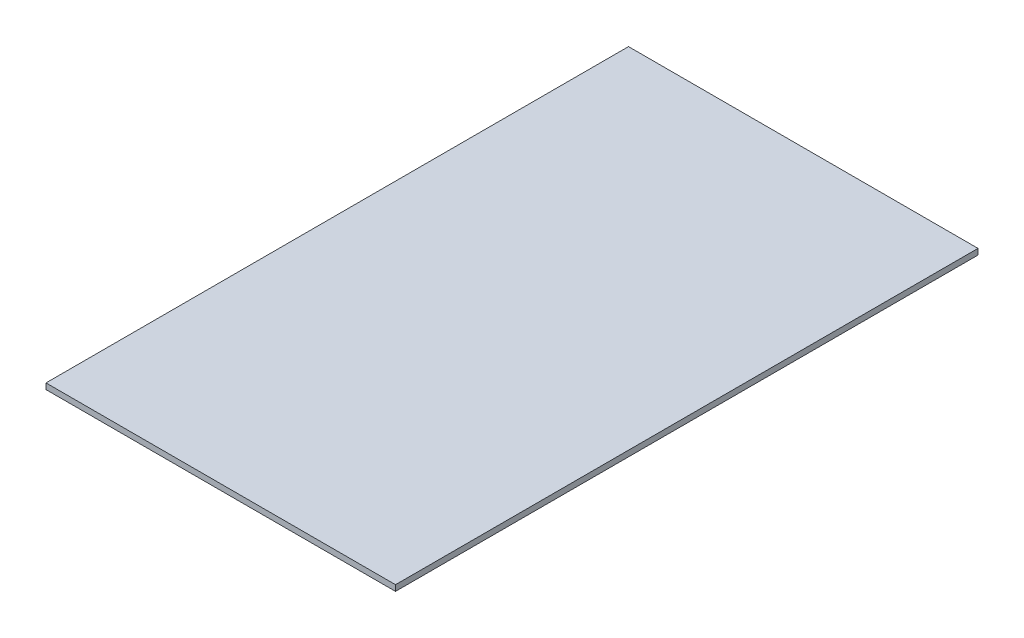
ISO-10303-21;
HEADER;
FILE_DESCRIPTION(('STEP AP214'),'2;1');
FILE_NAME('part.step','',(''),(''),'','','');
FILE_SCHEMA(('AUTOMOTIVE_DESIGN { 1 0 10303 214 1 1 1 1 }'));
ENDSEC;
DATA;
#1=APPLICATION_CONTEXT('core data for automotive mechanical design processes');
#2=APPLICATION_PROTOCOL_DEFINITION('international standard','automotive_design',2000,#1);
#3=PRODUCT_CONTEXT('',#1,'mechanical');
#4=PRODUCT('Part','Part','',(#3));
#5=PRODUCT_RELATED_PRODUCT_CATEGORY('part','',(#4));
#6=PRODUCT_DEFINITION_FORMATION('','',#4);
#7=PRODUCT_DEFINITION_CONTEXT('part definition',#1,'design');
#8=PRODUCT_DEFINITION('design','',#6,#7);
#9=PRODUCT_DEFINITION_SHAPE('','',#8);
#10=(LENGTH_UNIT() NAMED_UNIT(*) SI_UNIT(.MILLI.,.METRE.));
#11=(NAMED_UNIT(*) PLANE_ANGLE_UNIT() SI_UNIT($,.RADIAN.));
#12=(NAMED_UNIT(*) SI_UNIT($,.STERADIAN.) SOLID_ANGLE_UNIT());
#13=UNCERTAINTY_MEASURE_WITH_UNIT(LENGTH_MEASURE(1.E-05),#10,'distance_accuracy_value','');
#14=(GEOMETRIC_REPRESENTATION_CONTEXT(3) GLOBAL_UNCERTAINTY_ASSIGNED_CONTEXT((#13)) GLOBAL_UNIT_ASSIGNED_CONTEXT((#10,
#11,#12)) REPRESENTATION_CONTEXT('',''));
#15=CARTESIAN_POINT('',(0.,0.,0.));
#16=DIRECTION('',(0.,0.,1.));
#17=DIRECTION('',(1.,0.,0.));
#18=AXIS2_PLACEMENT_3D('',#15,#16,#17);
#19=CARTESIAN_POINT('',(-1020.,34.,-1020.));
#20=DIRECTION('',(0.,0.,-1.));
#21=DIRECTION('',(-1.,0.,0.));
#22=AXIS2_PLACEMENT_3D('',#19,#20,#21);
#23=PLANE('',#22);
#24=DIRECTION('',(1.,0.,0.));
#25=VECTOR('',#24,1.);
#26=CARTESIAN_POINT('',(-1020.,0.,-1020.));
#27=LINE('',#26,#25);
#28=CARTESIAN_POINT('',(-1020.,0.,-1020.));
#29=VERTEX_POINT('',#28);
#30=CARTESIAN_POINT('',(1020.,0.,-1020.));
#31=VERTEX_POINT('',#30);
#32=EDGE_CURVE('E93',#29,#31,#27,.T.);
#33=ORIENTED_EDGE('',*,*,#32,.F.);
#34=DIRECTION('',(0.,-1.,0.));
#35=VECTOR('',#34,1.);
#36=CARTESIAN_POINT('',(-1020.,34.,-1020.));
#37=LINE('',#36,#35);
#38=CARTESIAN_POINT('',(-1020.,34.,-1020.));
#39=VERTEX_POINT('',#38);
#40=EDGE_CURVE('E11',#39,#29,#37,.T.);
#41=ORIENTED_EDGE('',*,*,#40,.F.);
#42=DIRECTION('',(1.,0.,0.));
#43=VECTOR('',#42,1.);
#44=CARTESIAN_POINT('',(-1020.,34.,-1020.));
#45=LINE('',#44,#43);
#46=CARTESIAN_POINT('',(1020.,34.,-1020.));
#47=VERTEX_POINT('',#46);
#48=EDGE_CURVE('E85',#39,#47,#45,.T.);
#49=ORIENTED_EDGE('',*,*,#48,.T.);
#50=DIRECTION('',(0.,-1.,0.));
#51=VECTOR('',#50,1.);
#52=CARTESIAN_POINT('',(1020.,34.,-1020.));
#53=LINE('',#52,#51);
#54=EDGE_CURVE('E39',#47,#31,#53,.T.);
#55=ORIENTED_EDGE('',*,*,#54,.T.);
#56=EDGE_LOOP('',(#33,#41,#49,#55));
#57=FACE_BOUND('',#56,.T.);
#58=ADVANCED_FACE('F36',(#57),#23,.T.);
#59=CARTESIAN_POINT('',(-1020.,34.,-1020.));
#60=DIRECTION('',(1.,0.,0.));
#61=DIRECTION('',(0.,0.,-1.));
#62=AXIS2_PLACEMENT_3D('',#59,#60,#61);
#63=PLANE('',#62);
#64=DIRECTION('',(0.,0.,1.));
#65=VECTOR('',#64,1.);
#66=CARTESIAN_POINT('',(-1020.,0.,-1020.));
#67=LINE('',#66,#65);
#68=CARTESIAN_POINT('',(-1020.,0.,2380.));
#69=VERTEX_POINT('',#68);
#70=EDGE_CURVE('E102',#29,#69,#67,.T.);
#71=ORIENTED_EDGE('',*,*,#70,.T.);
#72=DIRECTION('',(0.,1.,0.));
#73=VECTOR('',#72,1.);
#74=CARTESIAN_POINT('',(-1020.,0.,2380.));
#75=LINE('',#74,#73);
#76=CARTESIAN_POINT('',(-1020.,34.,2380.));
#77=VERTEX_POINT('',#76);
#78=EDGE_CURVE('E94',#69,#77,#75,.T.);
#79=ORIENTED_EDGE('',*,*,#78,.T.);
#80=DIRECTION('',(0.,0.,1.));
#81=VECTOR('',#80,1.);
#82=CARTESIAN_POINT('',(-1020.,34.,-1020.));
#83=LINE('',#82,#81);
#84=EDGE_CURVE('E84',#39,#77,#83,.T.);
#85=ORIENTED_EDGE('',*,*,#84,.F.);
#86=ORIENTED_EDGE('',*,*,#40,.T.);
#87=EDGE_LOOP('',(#71,#79,#85,#86));
#88=FACE_BOUND('',#87,.T.);
#89=ADVANCED_FACE('F109',(#88),#63,.F.);
#90=CARTESIAN_POINT('',(1020.,34.,-1020.));
#91=DIRECTION('',(1.,0.,0.));
#92=DIRECTION('',(0.,0.,-1.));
#93=AXIS2_PLACEMENT_3D('',#90,#91,#92);
#94=PLANE('',#93);
#95=DIRECTION('',(0.,0.,1.));
#96=VECTOR('',#95,1.);
#97=CARTESIAN_POINT('',(1020.,0.,-1020.));
#98=LINE('',#97,#96);
#99=CARTESIAN_POINT('',(1020.,0.,2380.));
#100=VERTEX_POINT('',#99);
#101=EDGE_CURVE('E65',#31,#100,#98,.T.);
#102=ORIENTED_EDGE('',*,*,#101,.F.);
#103=ORIENTED_EDGE('',*,*,#54,.F.);
#104=DIRECTION('',(0.,0.,1.));
#105=VECTOR('',#104,1.);
#106=CARTESIAN_POINT('',(1020.,34.,-1020.));
#107=LINE('',#106,#105);
#108=CARTESIAN_POINT('',(1020.,34.,2380.));
#109=VERTEX_POINT('',#108);
#110=EDGE_CURVE('E76',#47,#109,#107,.T.);
#111=ORIENTED_EDGE('',*,*,#110,.T.);
#112=DIRECTION('',(0.,1.,0.));
#113=VECTOR('',#112,1.);
#114=CARTESIAN_POINT('',(1020.,0.,2380.));
#115=LINE('',#114,#113);
#116=EDGE_CURVE('E79',#100,#109,#115,.T.);
#117=ORIENTED_EDGE('',*,*,#116,.F.);
#118=EDGE_LOOP('',(#102,#103,#111,#117));
#119=FACE_BOUND('',#118,.T.);
#120=ADVANCED_FACE('F78',(#119),#94,.T.);
#121=CARTESIAN_POINT('',(0.,34.,0.));
#122=DIRECTION('',(0.,-1.,0.));
#123=DIRECTION('',(0.,0.,-1.));
#124=AXIS2_PLACEMENT_3D('',#121,#122,#123);
#125=PLANE('',#124);
#126=ORIENTED_EDGE('',*,*,#48,.F.);
#127=ORIENTED_EDGE('',*,*,#84,.T.);
#128=DIRECTION('',(1.,0.,0.));
#129=VECTOR('',#128,1.);
#130=CARTESIAN_POINT('',(-1020.,34.,2380.));
#131=LINE('',#130,#129);
#132=EDGE_CURVE('E91',#77,#109,#131,.T.);
#133=ORIENTED_EDGE('',*,*,#132,.T.);
#134=ORIENTED_EDGE('',*,*,#110,.F.);
#135=EDGE_LOOP('',(#126,#127,#133,#134));
#136=FACE_BOUND('',#135,.T.);
#137=ADVANCED_FACE('F96',(#136),#125,.F.);
#138=CARTESIAN_POINT('',(0.,0.,0.));
#139=DIRECTION('',(0.,-1.,0.));
#140=DIRECTION('',(0.,0.,-1.));
#141=AXIS2_PLACEMENT_3D('',#138,#139,#140);
#142=PLANE('',#141);
#143=ORIENTED_EDGE('',*,*,#32,.T.);
#144=ORIENTED_EDGE('',*,*,#101,.T.);
#145=DIRECTION('',(1.,0.,0.));
#146=VECTOR('',#145,1.);
#147=CARTESIAN_POINT('',(-1020.,0.,2380.));
#148=LINE('',#147,#146);
#149=EDGE_CURVE('E92',#69,#100,#148,.T.);
#150=ORIENTED_EDGE('',*,*,#149,.F.);
#151=ORIENTED_EDGE('',*,*,#70,.F.);
#152=EDGE_LOOP('',(#143,#144,#150,#151));
#153=FACE_BOUND('',#152,.T.);
#154=ADVANCED_FACE('F110',(#153),#142,.T.);
#155=CARTESIAN_POINT('',(-1020.,0.,2380.));
#156=DIRECTION('',(0.,0.,1.));
#157=DIRECTION('',(1.,0.,0.));
#158=AXIS2_PLACEMENT_3D('',#155,#156,#157);
#159=PLANE('',#158);
#160=ORIENTED_EDGE('',*,*,#132,.F.);
#161=ORIENTED_EDGE('',*,*,#78,.F.);
#162=ORIENTED_EDGE('',*,*,#149,.T.);
#163=ORIENTED_EDGE('',*,*,#116,.T.);
#164=EDGE_LOOP('',(#160,#161,#162,#163));
#165=FACE_BOUND('',#164,.T.);
#166=ADVANCED_FACE('F89',(#165),#159,.T.);
#167=CLOSED_SHELL('',(#58,#89,#120,#137,#154,#166));
#168=MANIFOLD_SOLID_BREP('B2',#167);
#169=ADVANCED_BREP_SHAPE_REPRESENTATION('',(#18,#168),#14);
#170=SHAPE_DEFINITION_REPRESENTATION(#9,#169);
ENDSEC;
END-ISO-10303-21;
